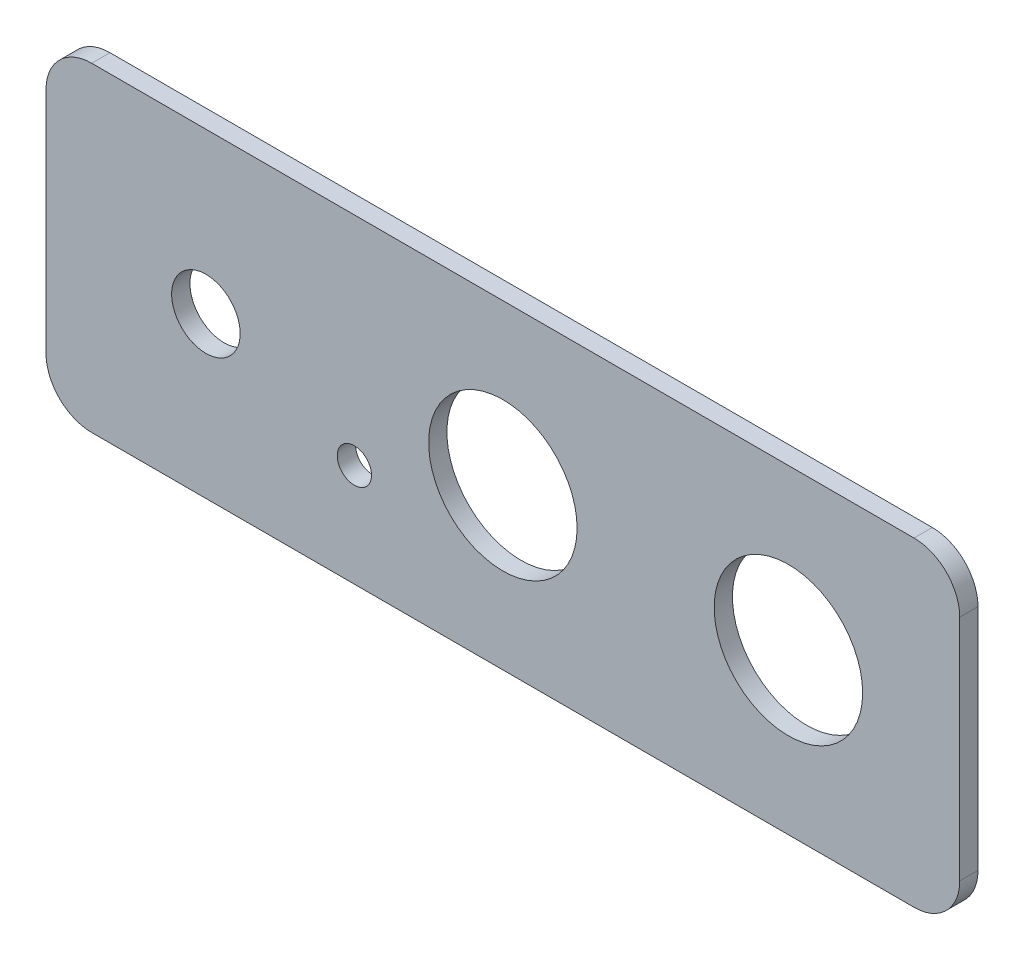
ISO-10303-21;
HEADER;
FILE_DESCRIPTION(('STEP AP214'),'2;1');
FILE_NAME('part.step','',(''),(''),'','','');
FILE_SCHEMA(('AUTOMOTIVE_DESIGN { 1 0 10303 214 1 1 1 1 }'));
ENDSEC;
DATA;
#1=APPLICATION_CONTEXT('core data for automotive mechanical design processes');
#2=APPLICATION_PROTOCOL_DEFINITION('international standard','automotive_design',2000,#1);
#3=PRODUCT_CONTEXT('',#1,'mechanical');
#4=PRODUCT('Part','Part','',(#3));
#5=PRODUCT_RELATED_PRODUCT_CATEGORY('part','',(#4));
#6=PRODUCT_DEFINITION_FORMATION('','',#4);
#7=PRODUCT_DEFINITION_CONTEXT('part definition',#1,'design');
#8=PRODUCT_DEFINITION('design','',#6,#7);
#9=PRODUCT_DEFINITION_SHAPE('','',#8);
#10=(LENGTH_UNIT() NAMED_UNIT(*) SI_UNIT(.MILLI.,.METRE.));
#11=(NAMED_UNIT(*) PLANE_ANGLE_UNIT() SI_UNIT($,.RADIAN.));
#12=(NAMED_UNIT(*) SI_UNIT($,.STERADIAN.) SOLID_ANGLE_UNIT());
#13=UNCERTAINTY_MEASURE_WITH_UNIT(LENGTH_MEASURE(1.E-05),#10,'distance_accuracy_value','');
#14=(GEOMETRIC_REPRESENTATION_CONTEXT(3) GLOBAL_UNCERTAINTY_ASSIGNED_CONTEXT((#13)) GLOBAL_UNIT_ASSIGNED_CONTEXT((#10,
#11,#12)) REPRESENTATION_CONTEXT('',''));
#15=CARTESIAN_POINT('',(0.,0.,0.));
#16=DIRECTION('',(0.,0.,1.));
#17=DIRECTION('',(1.,0.,0.));
#18=AXIS2_PLACEMENT_3D('',#15,#16,#17);
#19=CARTESIAN_POINT('',(-36.,-10.,1.6));
#20=DIRECTION('',(0.,0.,1.));
#21=DIRECTION('',(1.,0.,0.));
#22=AXIS2_PLACEMENT_3D('',#19,#20,#21);
#23=PLANE('',#22);
#24=CARTESIAN_POINT('',(25.,0.,1.6));
#25=DIRECTION('',(0.,0.,1.));
#26=DIRECTION('',(1.,0.,0.));
#27=AXIS2_PLACEMENT_3D('',#24,#25,#26);
#28=CIRCLE('',#27,6.5);
#29=CARTESIAN_POINT('',(31.5,0.,1.6));
#30=VERTEX_POINT('',#29);
#31=EDGE_CURVE('E223',#30,#30,#28,.T.);
#32=ORIENTED_EDGE('',*,*,#31,.F.);
#33=EDGE_LOOP('',(#32));
#34=FACE_BOUND('',#33,.T.);
#35=CARTESIAN_POINT('',(-26.,0.,1.6));
#36=DIRECTION('',(0.,0.,1.));
#37=DIRECTION('',(1.,0.,0.));
#38=AXIS2_PLACEMENT_3D('',#35,#36,#37);
#39=CIRCLE('',#38,3.);
#40=CARTESIAN_POINT('',(-23.,0.,1.6));
#41=VERTEX_POINT('',#40);
#42=EDGE_CURVE('E148',#41,#41,#39,.T.);
#43=ORIENTED_EDGE('',*,*,#42,.F.);
#44=EDGE_LOOP('',(#43));
#45=FACE_BOUND('',#44,.T.);
#46=CARTESIAN_POINT('',(-36.,-10.,1.6));
#47=DIRECTION('',(0.,0.,1.));
#48=DIRECTION('',(1.,0.,0.));
#49=AXIS2_PLACEMENT_3D('',#46,#47,#48);
#50=CIRCLE('',#49,4.);
#51=CARTESIAN_POINT('',(-40.,-9.99999999999997,1.6));
#52=VERTEX_POINT('',#51);
#53=CARTESIAN_POINT('',(-36.,-14.,1.6));
#54=VERTEX_POINT('',#53);
#55=EDGE_CURVE('E166',#52,#54,#50,.T.);
#56=ORIENTED_EDGE('',*,*,#55,.T.);
#57=DIRECTION('',(1.,0.,0.));
#58=VECTOR('',#57,1.);
#59=CARTESIAN_POINT('',(-36.,-14.,1.6));
#60=LINE('',#59,#58);
#61=CARTESIAN_POINT('',(36.,-14.,1.6));
#62=VERTEX_POINT('',#61);
#63=EDGE_CURVE('E102',#54,#62,#60,.T.);
#64=ORIENTED_EDGE('',*,*,#63,.T.);
#65=CARTESIAN_POINT('',(36.,-10.,1.6));
#66=DIRECTION('',(0.,0.,1.));
#67=DIRECTION('',(1.,0.,0.));
#68=AXIS2_PLACEMENT_3D('',#65,#66,#67);
#69=CIRCLE('',#68,4.);
#70=CARTESIAN_POINT('',(40.,-9.99999999999997,1.6));
#71=VERTEX_POINT('',#70);
#72=EDGE_CURVE('E187',#62,#71,#69,.T.);
#73=ORIENTED_EDGE('',*,*,#72,.T.);
#74=DIRECTION('',(0.,1.,0.));
#75=VECTOR('',#74,1.);
#76=CARTESIAN_POINT('',(40.,9.99999999999997,1.6));
#77=LINE('',#76,#75);
#78=CARTESIAN_POINT('',(40.,9.99999999999997,1.6));
#79=VERTEX_POINT('',#78);
#80=EDGE_CURVE('E201',#71,#79,#77,.T.);
#81=ORIENTED_EDGE('',*,*,#80,.T.);
#82=CARTESIAN_POINT('',(36.,10.,1.6));
#83=DIRECTION('',(0.,0.,1.));
#84=DIRECTION('',(-1.,0.,0.));
#85=AXIS2_PLACEMENT_3D('',#82,#83,#84);
#86=CIRCLE('',#85,4.);
#87=CARTESIAN_POINT('',(36.,14.,1.6));
#88=VERTEX_POINT('',#87);
#89=EDGE_CURVE('E121',#79,#88,#86,.T.);
#90=ORIENTED_EDGE('',*,*,#89,.T.);
#91=DIRECTION('',(-1.,0.,0.));
#92=VECTOR('',#91,1.);
#93=CARTESIAN_POINT('',(-36.,14.,1.6));
#94=LINE('',#93,#92);
#95=CARTESIAN_POINT('',(-36.,14.,1.6));
#96=VERTEX_POINT('',#95);
#97=EDGE_CURVE('E115',#88,#96,#94,.T.);
#98=ORIENTED_EDGE('',*,*,#97,.T.);
#99=CARTESIAN_POINT('',(-36.,10.,1.6));
#100=DIRECTION('',(0.,0.,1.));
#101=DIRECTION('',(1.,0.,0.));
#102=AXIS2_PLACEMENT_3D('',#99,#100,#101);
#103=CIRCLE('',#102,4.);
#104=CARTESIAN_POINT('',(-40.,9.99999999999997,1.6));
#105=VERTEX_POINT('',#104);
#106=EDGE_CURVE('E119',#96,#105,#103,.T.);
#107=ORIENTED_EDGE('',*,*,#106,.T.);
#108=DIRECTION('',(0.,-1.,0.));
#109=VECTOR('',#108,1.);
#110=CARTESIAN_POINT('',(-40.,9.99999999999997,1.6));
#111=LINE('',#110,#109);
#112=EDGE_CURVE('E59',#105,#52,#111,.T.);
#113=ORIENTED_EDGE('',*,*,#112,.T.);
#114=EDGE_LOOP('',(#56,#64,#73,#81,#90,#98,#107,#113));
#115=FACE_BOUND('',#114,.T.);
#116=CARTESIAN_POINT('',(0.,0.,1.6));
#117=DIRECTION('',(0.,0.,1.));
#118=DIRECTION('',(1.,0.,0.));
#119=AXIS2_PLACEMENT_3D('',#116,#117,#118);
#120=CIRCLE('',#119,6.5);
#121=CARTESIAN_POINT('',(6.5,0.,1.6));
#122=VERTEX_POINT('',#121);
#123=EDGE_CURVE('E215',#122,#122,#120,.T.);
#124=ORIENTED_EDGE('',*,*,#123,.F.);
#125=EDGE_LOOP('',(#124));
#126=FACE_BOUND('',#125,.T.);
#127=CARTESIAN_POINT('',(-13.,-5.,1.6));
#128=DIRECTION('',(0.,0.,1.));
#129=DIRECTION('',(1.,0.,0.));
#130=AXIS2_PLACEMENT_3D('',#127,#128,#129);
#131=CIRCLE('',#130,1.5);
#132=CARTESIAN_POINT('',(-11.5,-5.,1.6));
#133=VERTEX_POINT('',#132);
#134=EDGE_CURVE('E231',#133,#133,#131,.T.);
#135=ORIENTED_EDGE('',*,*,#134,.F.);
#136=EDGE_LOOP('',(#135));
#137=FACE_BOUND('',#136,.T.);
#138=ADVANCED_FACE('F41',(#34,#45,#115,#126,#137),#23,.T.);
#139=CARTESIAN_POINT('',(-36.,-10.,0.));
#140=DIRECTION('',(0.,0.,1.));
#141=DIRECTION('',(1.,0.,0.));
#142=AXIS2_PLACEMENT_3D('',#139,#140,#141);
#143=PLANE('',#142);
#144=CARTESIAN_POINT('',(-36.,-10.,0.));
#145=DIRECTION('',(0.,0.,1.));
#146=DIRECTION('',(1.,0.,0.));
#147=AXIS2_PLACEMENT_3D('',#144,#145,#146);
#148=CIRCLE('',#147,4.);
#149=CARTESIAN_POINT('',(-40.,-9.99999999999997,0.));
#150=VERTEX_POINT('',#149);
#151=CARTESIAN_POINT('',(-36.,-14.,0.));
#152=VERTEX_POINT('',#151);
#153=EDGE_CURVE('E143',#150,#152,#148,.T.);
#154=ORIENTED_EDGE('',*,*,#153,.F.);
#155=DIRECTION('',(0.,-1.,0.));
#156=VECTOR('',#155,1.);
#157=CARTESIAN_POINT('',(-40.,9.99999999999997,0.));
#158=LINE('',#157,#156);
#159=CARTESIAN_POINT('',(-40.,9.99999999999997,0.));
#160=VERTEX_POINT('',#159);
#161=EDGE_CURVE('E94',#160,#150,#158,.T.);
#162=ORIENTED_EDGE('',*,*,#161,.F.);
#163=CARTESIAN_POINT('',(-36.,10.,0.));
#164=DIRECTION('',(0.,0.,1.));
#165=DIRECTION('',(1.,0.,0.));
#166=AXIS2_PLACEMENT_3D('',#163,#164,#165);
#167=CIRCLE('',#166,4.);
#168=CARTESIAN_POINT('',(-36.,14.,0.));
#169=VERTEX_POINT('',#168);
#170=EDGE_CURVE('E88',#169,#160,#167,.T.);
#171=ORIENTED_EDGE('',*,*,#170,.F.);
#172=DIRECTION('',(-1.,0.,0.));
#173=VECTOR('',#172,1.);
#174=CARTESIAN_POINT('',(-36.,14.,0.));
#175=LINE('',#174,#173);
#176=CARTESIAN_POINT('',(36.,14.,0.));
#177=VERTEX_POINT('',#176);
#178=EDGE_CURVE('E130',#177,#169,#175,.T.);
#179=ORIENTED_EDGE('',*,*,#178,.F.);
#180=CARTESIAN_POINT('',(36.,10.,0.));
#181=DIRECTION('',(0.,0.,1.));
#182=DIRECTION('',(-1.,0.,0.));
#183=AXIS2_PLACEMENT_3D('',#180,#181,#182);
#184=CIRCLE('',#183,4.);
#185=CARTESIAN_POINT('',(40.,9.99999999999997,0.));
#186=VERTEX_POINT('',#185);
#187=EDGE_CURVE('E157',#186,#177,#184,.T.);
#188=ORIENTED_EDGE('',*,*,#187,.F.);
#189=DIRECTION('',(0.,1.,0.));
#190=VECTOR('',#189,1.);
#191=CARTESIAN_POINT('',(40.,9.99999999999997,0.));
#192=LINE('',#191,#190);
#193=CARTESIAN_POINT('',(40.,-9.99999999999997,0.));
#194=VERTEX_POINT('',#193);
#195=EDGE_CURVE('E154',#194,#186,#192,.T.);
#196=ORIENTED_EDGE('',*,*,#195,.F.);
#197=CARTESIAN_POINT('',(36.,-10.,0.));
#198=DIRECTION('',(0.,0.,1.));
#199=DIRECTION('',(1.,0.,0.));
#200=AXIS2_PLACEMENT_3D('',#197,#198,#199);
#201=CIRCLE('',#200,4.);
#202=CARTESIAN_POINT('',(36.,-14.,0.));
#203=VERTEX_POINT('',#202);
#204=EDGE_CURVE('E151',#203,#194,#201,.T.);
#205=ORIENTED_EDGE('',*,*,#204,.F.);
#206=DIRECTION('',(1.,0.,0.));
#207=VECTOR('',#206,1.);
#208=CARTESIAN_POINT('',(-36.,-14.,0.));
#209=LINE('',#208,#207);
#210=EDGE_CURVE('E147',#152,#203,#209,.T.);
#211=ORIENTED_EDGE('',*,*,#210,.F.);
#212=EDGE_LOOP('',(#154,#162,#171,#179,#188,#196,#205,#211));
#213=FACE_BOUND('',#212,.T.);
#214=CARTESIAN_POINT('',(-26.,0.,0.));
#215=DIRECTION('',(0.,0.,1.));
#216=DIRECTION('',(1.,0.,0.));
#217=AXIS2_PLACEMENT_3D('',#214,#215,#216);
#218=CIRCLE('',#217,3.);
#219=CARTESIAN_POINT('',(-23.,0.,0.));
#220=VERTEX_POINT('',#219);
#221=EDGE_CURVE('E211',#220,#220,#218,.T.);
#222=ORIENTED_EDGE('',*,*,#221,.T.);
#223=EDGE_LOOP('',(#222));
#224=FACE_BOUND('',#223,.T.);
#225=CARTESIAN_POINT('',(0.,0.,0.));
#226=DIRECTION('',(0.,0.,1.));
#227=DIRECTION('',(1.,0.,0.));
#228=AXIS2_PLACEMENT_3D('',#225,#226,#227);
#229=CIRCLE('',#228,6.5);
#230=CARTESIAN_POINT('',(6.5,0.,0.));
#231=VERTEX_POINT('',#230);
#232=EDGE_CURVE('E219',#231,#231,#229,.T.);
#233=ORIENTED_EDGE('',*,*,#232,.T.);
#234=EDGE_LOOP('',(#233));
#235=FACE_BOUND('',#234,.T.);
#236=CARTESIAN_POINT('',(25.,0.,0.));
#237=DIRECTION('',(0.,0.,1.));
#238=DIRECTION('',(1.,0.,0.));
#239=AXIS2_PLACEMENT_3D('',#236,#237,#238);
#240=CIRCLE('',#239,6.5);
#241=CARTESIAN_POINT('',(31.5,0.,0.));
#242=VERTEX_POINT('',#241);
#243=EDGE_CURVE('E227',#242,#242,#240,.T.);
#244=ORIENTED_EDGE('',*,*,#243,.T.);
#245=EDGE_LOOP('',(#244));
#246=FACE_BOUND('',#245,.T.);
#247=CARTESIAN_POINT('',(-13.,-5.,0.));
#248=DIRECTION('',(0.,0.,1.));
#249=DIRECTION('',(1.,0.,0.));
#250=AXIS2_PLACEMENT_3D('',#247,#248,#249);
#251=CIRCLE('',#250,1.5);
#252=CARTESIAN_POINT('',(-11.5,-5.,0.));
#253=VERTEX_POINT('',#252);
#254=EDGE_CURVE('E235',#253,#253,#251,.T.);
#255=ORIENTED_EDGE('',*,*,#254,.T.);
#256=EDGE_LOOP('',(#255));
#257=FACE_BOUND('',#256,.T.);
#258=ADVANCED_FACE('F191',(#213,#224,#235,#246,#257),#143,.F.);
#259=CARTESIAN_POINT('',(-36.,-10.,1.6));
#260=DIRECTION('',(0.,0.,-1.));
#261=DIRECTION('',(-1.,0.,0.));
#262=AXIS2_PLACEMENT_3D('',#259,#260,#261);
#263=CYLINDRICAL_SURFACE('',#262,4.);
#264=ORIENTED_EDGE('',*,*,#153,.T.);
#265=DIRECTION('',(0.,0.,-1.));
#266=VECTOR('',#265,1.);
#267=CARTESIAN_POINT('',(-36.,-14.,1.6));
#268=LINE('',#267,#266);
#269=EDGE_CURVE('E11',#54,#152,#268,.T.);
#270=ORIENTED_EDGE('',*,*,#269,.F.);
#271=ORIENTED_EDGE('',*,*,#55,.F.);
#272=DIRECTION('',(0.,0.,-1.));
#273=VECTOR('',#272,1.);
#274=CARTESIAN_POINT('',(-40.,-9.99999999999997,1.6));
#275=LINE('',#274,#273);
#276=EDGE_CURVE('E139',#52,#150,#275,.T.);
#277=ORIENTED_EDGE('',*,*,#276,.T.);
#278=EDGE_LOOP('',(#264,#270,#271,#277));
#279=FACE_BOUND('',#278,.T.);
#280=ADVANCED_FACE('F43',(#279),#263,.T.);
#281=CARTESIAN_POINT('',(-36.,-14.,1.6));
#282=DIRECTION('',(0.,1.,0.));
#283=DIRECTION('',(0.,0.,1.));
#284=AXIS2_PLACEMENT_3D('',#281,#282,#283);
#285=PLANE('',#284);
#286=ORIENTED_EDGE('',*,*,#210,.T.);
#287=DIRECTION('',(0.,0.,-1.));
#288=VECTOR('',#287,1.);
#289=CARTESIAN_POINT('',(36.,-14.,1.6));
#290=LINE('',#289,#288);
#291=EDGE_CURVE('E51',#62,#203,#290,.T.);
#292=ORIENTED_EDGE('',*,*,#291,.F.);
#293=ORIENTED_EDGE('',*,*,#63,.F.);
#294=ORIENTED_EDGE('',*,*,#269,.T.);
#295=EDGE_LOOP('',(#286,#292,#293,#294));
#296=FACE_BOUND('',#295,.T.);
#297=ADVANCED_FACE('F271',(#296),#285,.F.);
#298=CARTESIAN_POINT('',(36.,-10.,1.6));
#299=DIRECTION('',(0.,0.,-1.));
#300=DIRECTION('',(-1.,0.,0.));
#301=AXIS2_PLACEMENT_3D('',#298,#299,#300);
#302=CYLINDRICAL_SURFACE('',#301,4.);
#303=ORIENTED_EDGE('',*,*,#204,.T.);
#304=DIRECTION('',(0.,0.,-1.));
#305=VECTOR('',#304,1.);
#306=CARTESIAN_POINT('',(40.,-9.99999999999997,1.6));
#307=LINE('',#306,#305);
#308=EDGE_CURVE('E177',#71,#194,#307,.T.);
#309=ORIENTED_EDGE('',*,*,#308,.F.);
#310=ORIENTED_EDGE('',*,*,#72,.F.);
#311=ORIENTED_EDGE('',*,*,#291,.T.);
#312=EDGE_LOOP('',(#303,#309,#310,#311));
#313=FACE_BOUND('',#312,.T.);
#314=ADVANCED_FACE('F185',(#313),#302,.T.);
#315=CARTESIAN_POINT('',(40.,9.99999999999997,1.6));
#316=DIRECTION('',(-1.,0.,0.));
#317=DIRECTION('',(0.,0.,1.));
#318=AXIS2_PLACEMENT_3D('',#315,#316,#317);
#319=PLANE('',#318);
#320=ORIENTED_EDGE('',*,*,#195,.T.);
#321=DIRECTION('',(0.,0.,-1.));
#322=VECTOR('',#321,1.);
#323=CARTESIAN_POINT('',(40.,9.99999999999997,1.6));
#324=LINE('',#323,#322);
#325=EDGE_CURVE('E173',#79,#186,#324,.T.);
#326=ORIENTED_EDGE('',*,*,#325,.F.);
#327=ORIENTED_EDGE('',*,*,#80,.F.);
#328=ORIENTED_EDGE('',*,*,#308,.T.);
#329=EDGE_LOOP('',(#320,#326,#327,#328));
#330=FACE_BOUND('',#329,.T.);
#331=ADVANCED_FACE('F196',(#330),#319,.F.);
#332=CARTESIAN_POINT('',(36.,10.,1.6));
#333=DIRECTION('',(0.,0.,-1.));
#334=DIRECTION('',(-1.,0.,0.));
#335=AXIS2_PLACEMENT_3D('',#332,#333,#334);
#336=CYLINDRICAL_SURFACE('',#335,4.);
#337=ORIENTED_EDGE('',*,*,#187,.T.);
#338=DIRECTION('',(0.,0.,-1.));
#339=VECTOR('',#338,1.);
#340=CARTESIAN_POINT('',(36.,14.,1.6));
#341=LINE('',#340,#339);
#342=EDGE_CURVE('E132',#88,#177,#341,.T.);
#343=ORIENTED_EDGE('',*,*,#342,.F.);
#344=ORIENTED_EDGE('',*,*,#89,.F.);
#345=ORIENTED_EDGE('',*,*,#325,.T.);
#346=EDGE_LOOP('',(#337,#343,#344,#345));
#347=FACE_BOUND('',#346,.T.);
#348=ADVANCED_FACE('F199',(#347),#336,.T.);
#349=CARTESIAN_POINT('',(-36.,14.,1.6));
#350=DIRECTION('',(0.,-1.,0.));
#351=DIRECTION('',(0.,0.,-1.));
#352=AXIS2_PLACEMENT_3D('',#349,#350,#351);
#353=PLANE('',#352);
#354=ORIENTED_EDGE('',*,*,#178,.T.);
#355=DIRECTION('',(0.,0.,-1.));
#356=VECTOR('',#355,1.);
#357=CARTESIAN_POINT('',(-36.,14.,1.6));
#358=LINE('',#357,#356);
#359=EDGE_CURVE('E127',#96,#169,#358,.T.);
#360=ORIENTED_EDGE('',*,*,#359,.F.);
#361=ORIENTED_EDGE('',*,*,#97,.F.);
#362=ORIENTED_EDGE('',*,*,#342,.T.);
#363=EDGE_LOOP('',(#354,#360,#361,#362));
#364=FACE_BOUND('',#363,.T.);
#365=ADVANCED_FACE('F128',(#364),#353,.F.);
#366=CARTESIAN_POINT('',(-36.,10.,1.6));
#367=DIRECTION('',(0.,0.,-1.));
#368=DIRECTION('',(-1.,0.,0.));
#369=AXIS2_PLACEMENT_3D('',#366,#367,#368);
#370=CYLINDRICAL_SURFACE('',#369,4.);
#371=ORIENTED_EDGE('',*,*,#170,.T.);
#372=DIRECTION('',(0.,0.,-1.));
#373=VECTOR('',#372,1.);
#374=CARTESIAN_POINT('',(-40.,9.99999999999997,1.6));
#375=LINE('',#374,#373);
#376=EDGE_CURVE('E133',#105,#160,#375,.T.);
#377=ORIENTED_EDGE('',*,*,#376,.F.);
#378=ORIENTED_EDGE('',*,*,#106,.F.);
#379=ORIENTED_EDGE('',*,*,#359,.T.);
#380=EDGE_LOOP('',(#371,#377,#378,#379));
#381=FACE_BOUND('',#380,.T.);
#382=ADVANCED_FACE('F135',(#381),#370,.T.);
#383=CARTESIAN_POINT('',(-40.,9.99999999999997,1.6));
#384=DIRECTION('',(1.,0.,0.));
#385=DIRECTION('',(0.,1.,0.));
#386=AXIS2_PLACEMENT_3D('',#383,#384,#385);
#387=PLANE('',#386);
#388=ORIENTED_EDGE('',*,*,#161,.T.);
#389=ORIENTED_EDGE('',*,*,#276,.F.);
#390=ORIENTED_EDGE('',*,*,#112,.F.);
#391=ORIENTED_EDGE('',*,*,#376,.T.);
#392=EDGE_LOOP('',(#388,#389,#390,#391));
#393=FACE_BOUND('',#392,.T.);
#394=ADVANCED_FACE('F259',(#393),#387,.F.);
#395=CARTESIAN_POINT('',(-26.,0.,1.6));
#396=DIRECTION('',(0.,0.,-1.));
#397=DIRECTION('',(-1.,0.,0.));
#398=AXIS2_PLACEMENT_3D('',#395,#396,#397);
#399=CYLINDRICAL_SURFACE('',#398,3.);
#400=ORIENTED_EDGE('',*,*,#42,.T.);
#401=EDGE_LOOP('',(#400));
#402=FACE_BOUND('',#401,.T.);
#403=ORIENTED_EDGE('',*,*,#221,.F.);
#404=EDGE_LOOP('',(#403));
#405=FACE_BOUND('',#404,.T.);
#406=ADVANCED_FACE('F256',(#402,#405),#399,.F.);
#407=CARTESIAN_POINT('',(0.,0.,1.6));
#408=DIRECTION('',(0.,0.,-1.));
#409=DIRECTION('',(-1.,0.,0.));
#410=AXIS2_PLACEMENT_3D('',#407,#408,#409);
#411=CYLINDRICAL_SURFACE('',#410,6.5);
#412=ORIENTED_EDGE('',*,*,#123,.T.);
#413=EDGE_LOOP('',(#412));
#414=FACE_BOUND('',#413,.T.);
#415=ORIENTED_EDGE('',*,*,#232,.F.);
#416=EDGE_LOOP('',(#415));
#417=FACE_BOUND('',#416,.T.);
#418=ADVANCED_FACE('F339',(#414,#417),#411,.F.);
#419=CARTESIAN_POINT('',(25.,0.,1.6));
#420=DIRECTION('',(0.,0.,-1.));
#421=DIRECTION('',(-1.,0.,0.));
#422=AXIS2_PLACEMENT_3D('',#419,#420,#421);
#423=CYLINDRICAL_SURFACE('',#422,6.5);
#424=ORIENTED_EDGE('',*,*,#31,.T.);
#425=EDGE_LOOP('',(#424));
#426=FACE_BOUND('',#425,.T.);
#427=ORIENTED_EDGE('',*,*,#243,.F.);
#428=EDGE_LOOP('',(#427));
#429=FACE_BOUND('',#428,.T.);
#430=ADVANCED_FACE('F347',(#426,#429),#423,.F.);
#431=CARTESIAN_POINT('',(-13.,-5.,1.6));
#432=DIRECTION('',(0.,0.,-1.));
#433=DIRECTION('',(-1.,0.,0.));
#434=AXIS2_PLACEMENT_3D('',#431,#432,#433);
#435=CYLINDRICAL_SURFACE('',#434,1.5);
#436=ORIENTED_EDGE('',*,*,#134,.T.);
#437=EDGE_LOOP('',(#436));
#438=FACE_BOUND('',#437,.T.);
#439=ORIENTED_EDGE('',*,*,#254,.F.);
#440=EDGE_LOOP('',(#439));
#441=FACE_BOUND('',#440,.T.);
#442=ADVANCED_FACE('F243',(#438,#441),#435,.F.);
#443=CLOSED_SHELL('',(#138,#258,#280,#297,#314,#331,#348,#365,#382,#394,#406,#418,#430,#442));
#444=MANIFOLD_SOLID_BREP('B2',#443);
#445=ADVANCED_BREP_SHAPE_REPRESENTATION('',(#18,#444),#14);
#446=SHAPE_DEFINITION_REPRESENTATION(#9,#445);
ENDSEC;
END-ISO-10303-21;
